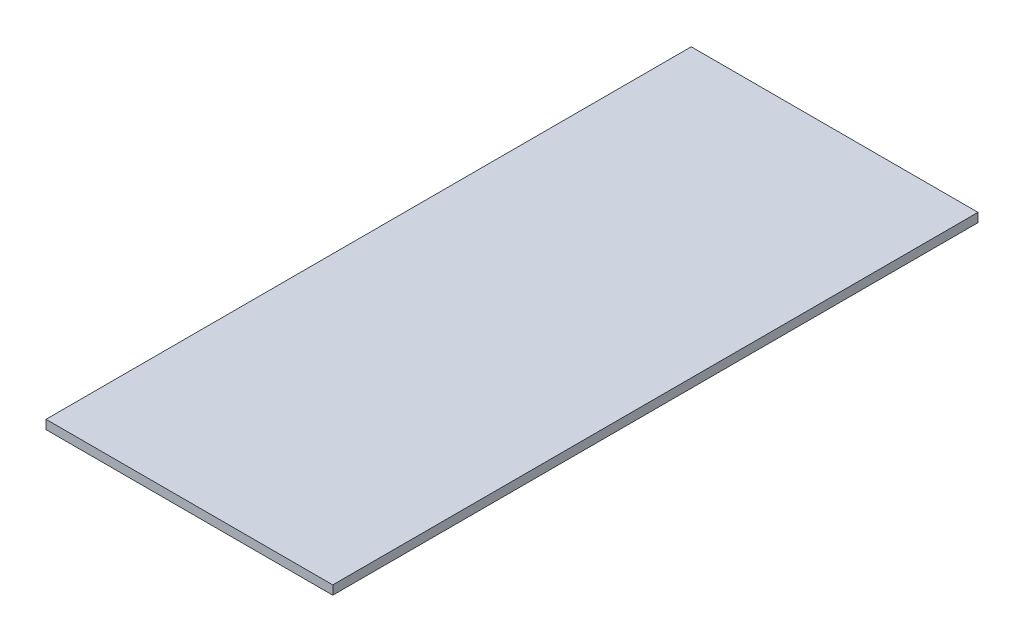
ISO-10303-21;
HEADER;
FILE_DESCRIPTION(('STEP AP214'),'2;1');
FILE_NAME('part.step','',(''),(''),'','','');
FILE_SCHEMA(('AUTOMOTIVE_DESIGN { 1 0 10303 214 1 1 1 1 }'));
ENDSEC;
DATA;
#1=APPLICATION_CONTEXT('core data for automotive mechanical design processes');
#2=APPLICATION_PROTOCOL_DEFINITION('international standard','automotive_design',2000,#1);
#3=PRODUCT_CONTEXT('',#1,'mechanical');
#4=PRODUCT('Part','Part','',(#3));
#5=PRODUCT_RELATED_PRODUCT_CATEGORY('part','',(#4));
#6=PRODUCT_DEFINITION_FORMATION('','',#4);
#7=PRODUCT_DEFINITION_CONTEXT('part definition',#1,'design');
#8=PRODUCT_DEFINITION('design','',#6,#7);
#9=PRODUCT_DEFINITION_SHAPE('','',#8);
#10=(LENGTH_UNIT() NAMED_UNIT(*) SI_UNIT(.MILLI.,.METRE.));
#11=(NAMED_UNIT(*) PLANE_ANGLE_UNIT() SI_UNIT($,.RADIAN.));
#12=(NAMED_UNIT(*) SI_UNIT($,.STERADIAN.) SOLID_ANGLE_UNIT());
#13=UNCERTAINTY_MEASURE_WITH_UNIT(LENGTH_MEASURE(1.E-05),#10,'distance_accuracy_value','');
#14=(GEOMETRIC_REPRESENTATION_CONTEXT(3) GLOBAL_UNCERTAINTY_ASSIGNED_CONTEXT((#13)) GLOBAL_UNIT_ASSIGNED_CONTEXT((#10,
#11,#12)) REPRESENTATION_CONTEXT('',''));
#15=CARTESIAN_POINT('',(0.,0.,0.));
#16=DIRECTION('',(0.,0.,1.));
#17=DIRECTION('',(1.,0.,0.));
#18=AXIS2_PLACEMENT_3D('',#15,#16,#17);
#19=CARTESIAN_POINT('',(-30.6996276411229,3.175,-42.9503076219948));
#20=DIRECTION('',(1.,0.,0.));
#21=DIRECTION('',(0.,0.,-1.));
#22=AXIS2_PLACEMENT_3D('',#19,#20,#21);
#23=PLANE('',#22);
#24=DIRECTION('',(0.,0.,1.));
#25=VECTOR('',#24,1.);
#26=CARTESIAN_POINT('',(-30.6996276411229,0.,-42.9503076219948));
#27=LINE('',#26,#25);
#28=CARTESIAN_POINT('',(-30.6996276411229,0.,-42.9503076219948));
#29=VERTEX_POINT('',#28);
#30=CARTESIAN_POINT('',(-30.6996276411228,0.,185.649692378005));
#31=VERTEX_POINT('',#30);
#32=EDGE_CURVE('E96',#29,#31,#27,.T.);
#33=ORIENTED_EDGE('',*,*,#32,.T.);
#34=DIRECTION('',(0.,-1.,0.));
#35=VECTOR('',#34,1.);
#36=CARTESIAN_POINT('',(-30.6996276411228,3.175,185.649692378005));
#37=LINE('',#36,#35);
#38=CARTESIAN_POINT('',(-30.6996276411228,3.175,185.649692378005));
#39=VERTEX_POINT('',#38);
#40=EDGE_CURVE('E11',#39,#31,#37,.T.);
#41=ORIENTED_EDGE('',*,*,#40,.F.);
#42=DIRECTION('',(0.,0.,1.));
#43=VECTOR('',#42,1.);
#44=CARTESIAN_POINT('',(-30.6996276411229,3.175,-42.9503076219948));
#45=LINE('',#44,#43);
#46=CARTESIAN_POINT('',(-30.6996276411229,3.175,-42.9503076219948));
#47=VERTEX_POINT('',#46);
#48=EDGE_CURVE('E84',#47,#39,#45,.T.);
#49=ORIENTED_EDGE('',*,*,#48,.F.);
#50=DIRECTION('',(0.,-1.,0.));
#51=VECTOR('',#50,1.);
#52=CARTESIAN_POINT('',(-30.6996276411229,3.175,-42.9503076219948));
#53=LINE('',#52,#51);
#54=EDGE_CURVE('E92',#47,#29,#53,.T.);
#55=ORIENTED_EDGE('',*,*,#54,.T.);
#56=EDGE_LOOP('',(#33,#41,#49,#55));
#57=FACE_BOUND('',#56,.T.);
#58=ADVANCED_FACE('F33',(#57),#23,.F.);
#59=CARTESIAN_POINT('',(-30.6996276411228,3.175,185.649692378005));
#60=DIRECTION('',(0.,0.,-1.));
#61=DIRECTION('',(-1.,0.,0.));
#62=AXIS2_PLACEMENT_3D('',#59,#60,#61);
#63=PLANE('',#62);
#64=DIRECTION('',(1.,0.,0.));
#65=VECTOR('',#64,1.);
#66=CARTESIAN_POINT('',(-30.6996276411228,0.,185.649692378005));
#67=LINE('',#66,#65);
#68=CARTESIAN_POINT('',(70.9003723588771,0.,185.649692378005));
#69=VERTEX_POINT('',#68);
#70=EDGE_CURVE('E88',#31,#69,#67,.T.);
#71=ORIENTED_EDGE('',*,*,#70,.T.);
#72=DIRECTION('',(0.,-1.,0.));
#73=VECTOR('',#72,1.);
#74=CARTESIAN_POINT('',(70.9003723588771,3.175,185.649692378005));
#75=LINE('',#74,#73);
#76=CARTESIAN_POINT('',(70.9003723588771,3.175,185.649692378005));
#77=VERTEX_POINT('',#76);
#78=EDGE_CURVE('E41',#77,#69,#75,.T.);
#79=ORIENTED_EDGE('',*,*,#78,.F.);
#80=DIRECTION('',(1.,0.,0.));
#81=VECTOR('',#80,1.);
#82=CARTESIAN_POINT('',(-30.6996276411228,3.175,185.649692378005));
#83=LINE('',#82,#81);
#84=EDGE_CURVE('E79',#39,#77,#83,.T.);
#85=ORIENTED_EDGE('',*,*,#84,.F.);
#86=ORIENTED_EDGE('',*,*,#40,.T.);
#87=EDGE_LOOP('',(#71,#79,#85,#86));
#88=FACE_BOUND('',#87,.T.);
#89=ADVANCED_FACE('F87',(#88),#63,.F.);
#90=CARTESIAN_POINT('',(70.9003723588771,3.175,-42.9503076219948));
#91=DIRECTION('',(-1.,0.,0.));
#92=DIRECTION('',(0.,0.,1.));
#93=AXIS2_PLACEMENT_3D('',#90,#91,#92);
#94=PLANE('',#93);
#95=DIRECTION('',(0.,0.,-1.));
#96=VECTOR('',#95,1.);
#97=CARTESIAN_POINT('',(70.9003723588771,0.,-42.9503076219948));
#98=LINE('',#97,#96);
#99=CARTESIAN_POINT('',(70.9003723588771,0.,-42.9503076219948));
#100=VERTEX_POINT('',#99);
#101=EDGE_CURVE('E66',#69,#100,#98,.T.);
#102=ORIENTED_EDGE('',*,*,#101,.T.);
#103=DIRECTION('',(0.,-1.,0.));
#104=VECTOR('',#103,1.);
#105=CARTESIAN_POINT('',(70.9003723588771,3.175,-42.9503076219948));
#106=LINE('',#105,#104);
#107=CARTESIAN_POINT('',(70.9003723588771,3.175,-42.9503076219948));
#108=VERTEX_POINT('',#107);
#109=EDGE_CURVE('E89',#108,#100,#106,.T.);
#110=ORIENTED_EDGE('',*,*,#109,.F.);
#111=DIRECTION('',(0.,0.,-1.));
#112=VECTOR('',#111,1.);
#113=CARTESIAN_POINT('',(70.9003723588771,3.175,-42.9503076219948));
#114=LINE('',#113,#112);
#115=EDGE_CURVE('E82',#77,#108,#114,.T.);
#116=ORIENTED_EDGE('',*,*,#115,.F.);
#117=ORIENTED_EDGE('',*,*,#78,.T.);
#118=EDGE_LOOP('',(#102,#110,#116,#117));
#119=FACE_BOUND('',#118,.T.);
#120=ADVANCED_FACE('F90',(#119),#94,.F.);
#121=CARTESIAN_POINT('',(-30.6996276411229,3.175,-42.9503076219948));
#122=DIRECTION('',(0.,0.,1.));
#123=DIRECTION('',(1.,0.,0.));
#124=AXIS2_PLACEMENT_3D('',#121,#122,#123);
#125=PLANE('',#124);
#126=DIRECTION('',(-1.,0.,0.));
#127=VECTOR('',#126,1.);
#128=CARTESIAN_POINT('',(-30.6996276411229,0.,-42.9503076219948));
#129=LINE('',#128,#127);
#130=EDGE_CURVE('E72',#100,#29,#129,.T.);
#131=ORIENTED_EDGE('',*,*,#130,.T.);
#132=ORIENTED_EDGE('',*,*,#54,.F.);
#133=DIRECTION('',(-1.,0.,0.));
#134=VECTOR('',#133,1.);
#135=CARTESIAN_POINT('',(-30.6996276411229,3.175,-42.9503076219948));
#136=LINE('',#135,#134);
#137=EDGE_CURVE('E49',#108,#47,#136,.T.);
#138=ORIENTED_EDGE('',*,*,#137,.F.);
#139=ORIENTED_EDGE('',*,*,#109,.T.);
#140=EDGE_LOOP('',(#131,#132,#138,#139));
#141=FACE_BOUND('',#140,.T.);
#142=ADVANCED_FACE('F103',(#141),#125,.F.);
#143=CARTESIAN_POINT('',(0.,3.175,0.));
#144=DIRECTION('',(0.,1.,0.));
#145=DIRECTION('',(0.,0.,1.));
#146=AXIS2_PLACEMENT_3D('',#143,#144,#145);
#147=PLANE('',#146);
#148=ORIENTED_EDGE('',*,*,#48,.T.);
#149=ORIENTED_EDGE('',*,*,#84,.T.);
#150=ORIENTED_EDGE('',*,*,#115,.T.);
#151=ORIENTED_EDGE('',*,*,#137,.T.);
#152=EDGE_LOOP('',(#148,#149,#150,#151));
#153=FACE_BOUND('',#152,.T.);
#154=ADVANCED_FACE('F80',(#153),#147,.T.);
#155=CARTESIAN_POINT('',(0.,0.,0.));
#156=DIRECTION('',(0.,1.,0.));
#157=DIRECTION('',(0.,0.,1.));
#158=AXIS2_PLACEMENT_3D('',#155,#156,#157);
#159=PLANE('',#158);
#160=ORIENTED_EDGE('',*,*,#32,.F.);
#161=ORIENTED_EDGE('',*,*,#130,.F.);
#162=ORIENTED_EDGE('',*,*,#101,.F.);
#163=ORIENTED_EDGE('',*,*,#70,.F.);
#164=EDGE_LOOP('',(#160,#161,#162,#163));
#165=FACE_BOUND('',#164,.T.);
#166=ADVANCED_FACE('F106',(#165),#159,.F.);
#167=CLOSED_SHELL('',(#58,#89,#120,#142,#154,#166));
#168=MANIFOLD_SOLID_BREP('B2',#167);
#169=ADVANCED_BREP_SHAPE_REPRESENTATION('',(#18,#168),#14);
#170=SHAPE_DEFINITION_REPRESENTATION(#9,#169);
ENDSEC;
END-ISO-10303-21;
